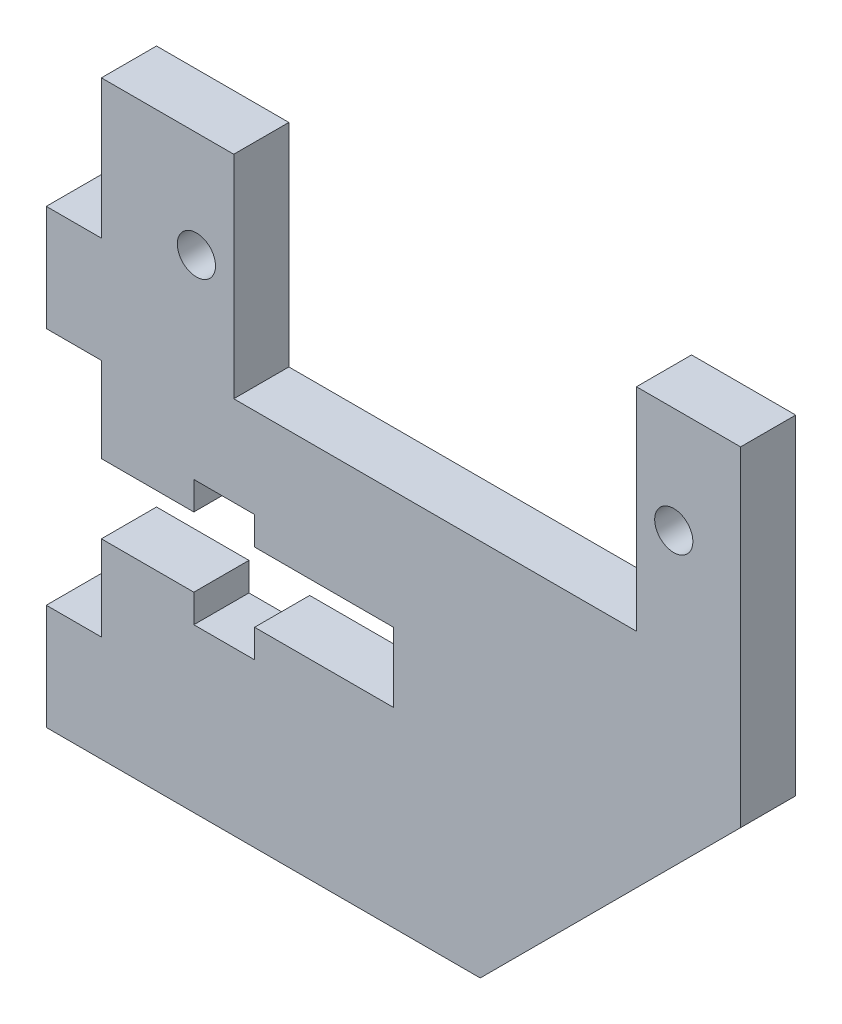
ISO-10303-21;
HEADER;
FILE_DESCRIPTION(('STEP AP214'),'2;1');
FILE_NAME('part.step','',(''),(''),'','','');
FILE_SCHEMA(('AUTOMOTIVE_DESIGN { 1 0 10303 214 1 1 1 1 }'));
ENDSEC;
DATA;
#1=APPLICATION_CONTEXT('core data for automotive mechanical design processes');
#2=APPLICATION_PROTOCOL_DEFINITION('international standard','automotive_design',2000,#1);
#3=PRODUCT_CONTEXT('',#1,'mechanical');
#4=PRODUCT('Part','Part','',(#3));
#5=PRODUCT_RELATED_PRODUCT_CATEGORY('part','',(#4));
#6=PRODUCT_DEFINITION_FORMATION('','',#4);
#7=PRODUCT_DEFINITION_CONTEXT('part definition',#1,'design');
#8=PRODUCT_DEFINITION('design','',#6,#7);
#9=PRODUCT_DEFINITION_SHAPE('','',#8);
#10=(LENGTH_UNIT() NAMED_UNIT(*) SI_UNIT(.MILLI.,.METRE.));
#11=(NAMED_UNIT(*) PLANE_ANGLE_UNIT() SI_UNIT($,.RADIAN.));
#12=(NAMED_UNIT(*) SI_UNIT($,.STERADIAN.) SOLID_ANGLE_UNIT());
#13=UNCERTAINTY_MEASURE_WITH_UNIT(LENGTH_MEASURE(1.E-05),#10,'distance_accuracy_value','');
#14=(GEOMETRIC_REPRESENTATION_CONTEXT(3) GLOBAL_UNCERTAINTY_ASSIGNED_CONTEXT((#13)) GLOBAL_UNIT_ASSIGNED_CONTEXT((#10,
#11,#12)) REPRESENTATION_CONTEXT('',''));
#15=CARTESIAN_POINT('',(0.,0.,0.));
#16=DIRECTION('',(0.,0.,1.));
#17=DIRECTION('',(1.,0.,0.));
#18=AXIS2_PLACEMENT_3D('',#15,#16,#17);
#19=CARTESIAN_POINT('',(3.175,0.,3.175));
#20=DIRECTION('',(1.,0.,0.));
#21=DIRECTION('',(0.,1.,0.));
#22=AXIS2_PLACEMENT_3D('',#19,#20,#21);
#23=PLANE('',#22);
#24=DIRECTION('',(0.,-1.,0.));
#25=VECTOR('',#24,1.);
#26=CARTESIAN_POINT('',(3.175,0.,0.));
#27=LINE('',#26,#25);
#28=CARTESIAN_POINT('',(3.175,19.9,0.));
#29=VERTEX_POINT('',#28);
#30=CARTESIAN_POINT('',(3.175,15.,0.));
#31=VERTEX_POINT('',#30);
#32=EDGE_CURVE('E239',#29,#31,#27,.T.);
#33=ORIENTED_EDGE('',*,*,#32,.T.);
#34=DIRECTION('',(0.,0.,-1.));
#35=VECTOR('',#34,1.);
#36=CARTESIAN_POINT('',(3.175,15.,3.175));
#37=LINE('',#36,#35);
#38=CARTESIAN_POINT('',(3.175,15.,3.175));
#39=VERTEX_POINT('',#38);
#40=EDGE_CURVE('E219',#39,#31,#37,.T.);
#41=ORIENTED_EDGE('',*,*,#40,.F.);
#42=DIRECTION('',(0.,-1.,0.));
#43=VECTOR('',#42,1.);
#44=CARTESIAN_POINT('',(3.175,0.,3.175));
#45=LINE('',#44,#43);
#46=CARTESIAN_POINT('',(3.175,19.9,3.175));
#47=VERTEX_POINT('',#46);
#48=EDGE_CURVE('E226',#47,#39,#45,.T.);
#49=ORIENTED_EDGE('',*,*,#48,.F.);
#50=DIRECTION('',(0.,0.,-1.));
#51=VECTOR('',#50,1.);
#52=CARTESIAN_POINT('',(3.175,19.9,3.175));
#53=LINE('',#52,#51);
#54=EDGE_CURVE('E295',#47,#29,#53,.T.);
#55=ORIENTED_EDGE('',*,*,#54,.T.);
#56=EDGE_LOOP('',(#33,#41,#49,#55));
#57=FACE_BOUND('',#56,.T.);
#58=ADVANCED_FACE('F35',(#57),#23,.F.);
#59=CARTESIAN_POINT('',(0.,15.,3.175));
#60=DIRECTION('',(0.,1.,0.));
#61=DIRECTION('',(0.,0.,1.));
#62=AXIS2_PLACEMENT_3D('',#59,#60,#61);
#63=PLANE('',#62);
#64=DIRECTION('',(1.,0.,0.));
#65=VECTOR('',#64,1.);
#66=CARTESIAN_POINT('',(0.,15.,0.));
#67=LINE('',#66,#65);
#68=CARTESIAN_POINT('',(8.5,15.,0.));
#69=VERTEX_POINT('',#68);
#70=EDGE_CURVE('E364',#31,#69,#67,.T.);
#71=ORIENTED_EDGE('',*,*,#70,.T.);
#72=DIRECTION('',(0.,0.,-1.));
#73=VECTOR('',#72,1.);
#74=CARTESIAN_POINT('',(8.5,15.,3.175));
#75=LINE('',#74,#73);
#76=CARTESIAN_POINT('',(8.5,15.,3.175));
#77=VERTEX_POINT('',#76);
#78=EDGE_CURVE('E221',#77,#69,#75,.T.);
#79=ORIENTED_EDGE('',*,*,#78,.F.);
#80=DIRECTION('',(1.,0.,0.));
#81=VECTOR('',#80,1.);
#82=CARTESIAN_POINT('',(0.,15.,3.175));
#83=LINE('',#82,#81);
#84=EDGE_CURVE('E214',#39,#77,#83,.T.);
#85=ORIENTED_EDGE('',*,*,#84,.F.);
#86=ORIENTED_EDGE('',*,*,#40,.T.);
#87=EDGE_LOOP('',(#71,#79,#85,#86));
#88=FACE_BOUND('',#87,.T.);
#89=ADVANCED_FACE('F217',(#88),#63,.F.);
#90=CARTESIAN_POINT('',(8.5,0.,3.175));
#91=DIRECTION('',(1.,0.,0.));
#92=DIRECTION('',(0.,0.,-1.));
#93=AXIS2_PLACEMENT_3D('',#90,#91,#92);
#94=PLANE('',#93);
#95=DIRECTION('',(0.,-1.,0.));
#96=VECTOR('',#95,1.);
#97=CARTESIAN_POINT('',(8.5,0.,0.));
#98=LINE('',#97,#96);
#99=CARTESIAN_POINT('',(8.5,16.625,0.));
#100=VERTEX_POINT('',#99);
#101=EDGE_CURVE('E361',#100,#69,#98,.T.);
#102=ORIENTED_EDGE('',*,*,#101,.F.);
#103=DIRECTION('',(0.,0.,-1.));
#104=VECTOR('',#103,1.);
#105=CARTESIAN_POINT('',(8.5,16.625,3.175));
#106=LINE('',#105,#104);
#107=CARTESIAN_POINT('',(8.5,16.625,3.175));
#108=VERTEX_POINT('',#107);
#109=EDGE_CURVE('E244',#108,#100,#106,.T.);
#110=ORIENTED_EDGE('',*,*,#109,.F.);
#111=DIRECTION('',(0.,-1.,0.));
#112=VECTOR('',#111,1.);
#113=CARTESIAN_POINT('',(8.5,0.,3.175));
#114=LINE('',#113,#112);
#115=EDGE_CURVE('E225',#108,#77,#114,.T.);
#116=ORIENTED_EDGE('',*,*,#115,.T.);
#117=ORIENTED_EDGE('',*,*,#78,.T.);
#118=EDGE_LOOP('',(#102,#110,#116,#117));
#119=FACE_BOUND('',#118,.T.);
#120=ADVANCED_FACE('F499',(#119),#94,.T.);
#121=CARTESIAN_POINT('',(0.,16.625,3.175));
#122=DIRECTION('',(0.,1.,0.));
#123=DIRECTION('',(0.,0.,1.));
#124=AXIS2_PLACEMENT_3D('',#121,#122,#123);
#125=PLANE('',#124);
#126=DIRECTION('',(1.,0.,0.));
#127=VECTOR('',#126,1.);
#128=CARTESIAN_POINT('',(0.,16.625,0.));
#129=LINE('',#128,#127);
#130=CARTESIAN_POINT('',(12.,16.625,0.));
#131=VERTEX_POINT('',#130);
#132=EDGE_CURVE('E359',#100,#131,#129,.T.);
#133=ORIENTED_EDGE('',*,*,#132,.T.);
#134=DIRECTION('',(0.,0.,-1.));
#135=VECTOR('',#134,1.);
#136=CARTESIAN_POINT('',(12.,16.625,3.175));
#137=LINE('',#136,#135);
#138=CARTESIAN_POINT('',(12.,16.625,3.175));
#139=VERTEX_POINT('',#138);
#140=EDGE_CURVE('E249',#139,#131,#137,.T.);
#141=ORIENTED_EDGE('',*,*,#140,.F.);
#142=DIRECTION('',(1.,0.,0.));
#143=VECTOR('',#142,1.);
#144=CARTESIAN_POINT('',(0.,16.625,3.175));
#145=LINE('',#144,#143);
#146=EDGE_CURVE('E430',#108,#139,#145,.T.);
#147=ORIENTED_EDGE('',*,*,#146,.F.);
#148=ORIENTED_EDGE('',*,*,#109,.T.);
#149=EDGE_LOOP('',(#133,#141,#147,#148));
#150=FACE_BOUND('',#149,.T.);
#151=ADVANCED_FACE('F505',(#150),#125,.F.);
#152=CARTESIAN_POINT('',(12.,0.,3.175));
#153=DIRECTION('',(1.,0.,0.));
#154=DIRECTION('',(0.,0.,-1.));
#155=AXIS2_PLACEMENT_3D('',#152,#153,#154);
#156=PLANE('',#155);
#157=DIRECTION('',(0.,-1.,0.));
#158=VECTOR('',#157,1.);
#159=CARTESIAN_POINT('',(12.,0.,0.));
#160=LINE('',#159,#158);
#161=CARTESIAN_POINT('',(12.,15.,0.));
#162=VERTEX_POINT('',#161);
#163=EDGE_CURVE('E357',#131,#162,#160,.T.);
#164=ORIENTED_EDGE('',*,*,#163,.T.);
#165=DIRECTION('',(0.,0.,-1.));
#166=VECTOR('',#165,1.);
#167=CARTESIAN_POINT('',(12.,15.,3.175));
#168=LINE('',#167,#166);
#169=CARTESIAN_POINT('',(12.,15.,3.175));
#170=VERTEX_POINT('',#169);
#171=EDGE_CURVE('E252',#170,#162,#168,.T.);
#172=ORIENTED_EDGE('',*,*,#171,.F.);
#173=DIRECTION('',(0.,-1.,0.));
#174=VECTOR('',#173,1.);
#175=CARTESIAN_POINT('',(12.,0.,3.175));
#176=LINE('',#175,#174);
#177=EDGE_CURVE('E428',#139,#170,#176,.T.);
#178=ORIENTED_EDGE('',*,*,#177,.F.);
#179=ORIENTED_EDGE('',*,*,#140,.T.);
#180=EDGE_LOOP('',(#164,#172,#178,#179));
#181=FACE_BOUND('',#180,.T.);
#182=ADVANCED_FACE('F507',(#181),#156,.F.);
#183=CARTESIAN_POINT('',(0.,15.,3.175));
#184=DIRECTION('',(0.,1.,0.));
#185=DIRECTION('',(0.,0.,1.));
#186=AXIS2_PLACEMENT_3D('',#183,#184,#185);
#187=PLANE('',#186);
#188=DIRECTION('',(1.,0.,0.));
#189=VECTOR('',#188,1.);
#190=CARTESIAN_POINT('',(0.,15.,0.));
#191=LINE('',#190,#189);
#192=CARTESIAN_POINT('',(20.,15.,0.));
#193=VERTEX_POINT('',#192);
#194=EDGE_CURVE('E355',#162,#193,#191,.T.);
#195=ORIENTED_EDGE('',*,*,#194,.T.);
#196=DIRECTION('',(0.,0.,-1.));
#197=VECTOR('',#196,1.);
#198=CARTESIAN_POINT('',(20.,15.,3.175));
#199=LINE('',#198,#197);
#200=CARTESIAN_POINT('',(20.,15.,3.175));
#201=VERTEX_POINT('',#200);
#202=EDGE_CURVE('E255',#201,#193,#199,.T.);
#203=ORIENTED_EDGE('',*,*,#202,.F.);
#204=DIRECTION('',(1.,0.,0.));
#205=VECTOR('',#204,1.);
#206=CARTESIAN_POINT('',(0.,15.,3.175));
#207=LINE('',#206,#205);
#208=EDGE_CURVE('E426',#170,#201,#207,.T.);
#209=ORIENTED_EDGE('',*,*,#208,.F.);
#210=ORIENTED_EDGE('',*,*,#171,.T.);
#211=EDGE_LOOP('',(#195,#203,#209,#210));
#212=FACE_BOUND('',#211,.T.);
#213=ADVANCED_FACE('F512',(#212),#187,.F.);
#214=CARTESIAN_POINT('',(20.,0.,3.175));
#215=DIRECTION('',(1.,0.,0.));
#216=DIRECTION('',(0.,0.,-1.));
#217=AXIS2_PLACEMENT_3D('',#214,#215,#216);
#218=PLANE('',#217);
#219=DIRECTION('',(0.,-1.,0.));
#220=VECTOR('',#219,1.);
#221=CARTESIAN_POINT('',(20.,0.,0.));
#222=LINE('',#221,#220);
#223=CARTESIAN_POINT('',(20.,11.,0.));
#224=VERTEX_POINT('',#223);
#225=EDGE_CURVE('E352',#193,#224,#222,.T.);
#226=ORIENTED_EDGE('',*,*,#225,.T.);
#227=DIRECTION('',(0.,0.,-1.));
#228=VECTOR('',#227,1.);
#229=CARTESIAN_POINT('',(20.,11.,3.175));
#230=LINE('',#229,#228);
#231=CARTESIAN_POINT('',(20.,11.,3.175));
#232=VERTEX_POINT('',#231);
#233=EDGE_CURVE('E258',#232,#224,#230,.T.);
#234=ORIENTED_EDGE('',*,*,#233,.F.);
#235=DIRECTION('',(0.,-1.,0.));
#236=VECTOR('',#235,1.);
#237=CARTESIAN_POINT('',(20.,0.,3.175));
#238=LINE('',#237,#236);
#239=EDGE_CURVE('E424',#201,#232,#238,.T.);
#240=ORIENTED_EDGE('',*,*,#239,.F.);
#241=ORIENTED_EDGE('',*,*,#202,.T.);
#242=EDGE_LOOP('',(#226,#234,#240,#241));
#243=FACE_BOUND('',#242,.T.);
#244=ADVANCED_FACE('F517',(#243),#218,.F.);
#245=CARTESIAN_POINT('',(0.,11.,3.175));
#246=DIRECTION('',(0.,1.,0.));
#247=DIRECTION('',(0.,0.,1.));
#248=AXIS2_PLACEMENT_3D('',#245,#246,#247);
#249=PLANE('',#248);
#250=DIRECTION('',(1.,0.,0.));
#251=VECTOR('',#250,1.);
#252=CARTESIAN_POINT('',(0.,11.,0.));
#253=LINE('',#252,#251);
#254=CARTESIAN_POINT('',(12.,11.,0.));
#255=VERTEX_POINT('',#254);
#256=EDGE_CURVE('E349',#255,#224,#253,.T.);
#257=ORIENTED_EDGE('',*,*,#256,.F.);
#258=DIRECTION('',(0.,0.,-1.));
#259=VECTOR('',#258,1.);
#260=CARTESIAN_POINT('',(12.,11.,3.175));
#261=LINE('',#260,#259);
#262=CARTESIAN_POINT('',(12.,11.,3.175));
#263=VERTEX_POINT('',#262);
#264=EDGE_CURVE('E260',#263,#255,#261,.T.);
#265=ORIENTED_EDGE('',*,*,#264,.F.);
#266=DIRECTION('',(1.,0.,0.));
#267=VECTOR('',#266,1.);
#268=CARTESIAN_POINT('',(0.,11.,3.175));
#269=LINE('',#268,#267);
#270=EDGE_CURVE('E421',#263,#232,#269,.T.);
#271=ORIENTED_EDGE('',*,*,#270,.T.);
#272=ORIENTED_EDGE('',*,*,#233,.T.);
#273=EDGE_LOOP('',(#257,#265,#271,#272));
#274=FACE_BOUND('',#273,.T.);
#275=ADVANCED_FACE('F521',(#274),#249,.T.);
#276=CARTESIAN_POINT('',(12.,0.,3.175));
#277=DIRECTION('',(1.,0.,0.));
#278=DIRECTION('',(0.,0.,-1.));
#279=AXIS2_PLACEMENT_3D('',#276,#277,#278);
#280=PLANE('',#279);
#281=DIRECTION('',(0.,-1.,0.));
#282=VECTOR('',#281,1.);
#283=CARTESIAN_POINT('',(12.,0.,0.));
#284=LINE('',#283,#282);
#285=CARTESIAN_POINT('',(12.,9.375,0.));
#286=VERTEX_POINT('',#285);
#287=EDGE_CURVE('E346',#255,#286,#284,.T.);
#288=ORIENTED_EDGE('',*,*,#287,.T.);
#289=DIRECTION('',(0.,0.,-1.));
#290=VECTOR('',#289,1.);
#291=CARTESIAN_POINT('',(12.,9.375,3.175));
#292=LINE('',#291,#290);
#293=CARTESIAN_POINT('',(12.,9.375,3.175));
#294=VERTEX_POINT('',#293);
#295=EDGE_CURVE('E262',#294,#286,#292,.T.);
#296=ORIENTED_EDGE('',*,*,#295,.F.);
#297=DIRECTION('',(0.,-1.,0.));
#298=VECTOR('',#297,1.);
#299=CARTESIAN_POINT('',(12.,0.,3.175));
#300=LINE('',#299,#298);
#301=EDGE_CURVE('E419',#263,#294,#300,.T.);
#302=ORIENTED_EDGE('',*,*,#301,.F.);
#303=ORIENTED_EDGE('',*,*,#264,.T.);
#304=EDGE_LOOP('',(#288,#296,#302,#303));
#305=FACE_BOUND('',#304,.T.);
#306=ADVANCED_FACE('F526',(#305),#280,.F.);
#307=CARTESIAN_POINT('',(0.,9.375,3.175));
#308=DIRECTION('',(0.,1.,0.));
#309=DIRECTION('',(0.,0.,1.));
#310=AXIS2_PLACEMENT_3D('',#307,#308,#309);
#311=PLANE('',#310);
#312=DIRECTION('',(1.,0.,0.));
#313=VECTOR('',#312,1.);
#314=CARTESIAN_POINT('',(0.,9.375,0.));
#315=LINE('',#314,#313);
#316=CARTESIAN_POINT('',(8.5,9.375,0.));
#317=VERTEX_POINT('',#316);
#318=EDGE_CURVE('E343',#317,#286,#315,.T.);
#319=ORIENTED_EDGE('',*,*,#318,.F.);
#320=DIRECTION('',(0.,0.,-1.));
#321=VECTOR('',#320,1.);
#322=CARTESIAN_POINT('',(8.5,9.375,3.175));
#323=LINE('',#322,#321);
#324=CARTESIAN_POINT('',(8.5,9.375,3.175));
#325=VERTEX_POINT('',#324);
#326=EDGE_CURVE('E264',#325,#317,#323,.T.);
#327=ORIENTED_EDGE('',*,*,#326,.F.);
#328=DIRECTION('',(1.,0.,0.));
#329=VECTOR('',#328,1.);
#330=CARTESIAN_POINT('',(0.,9.375,3.175));
#331=LINE('',#330,#329);
#332=EDGE_CURVE('E416',#325,#294,#331,.T.);
#333=ORIENTED_EDGE('',*,*,#332,.T.);
#334=ORIENTED_EDGE('',*,*,#295,.T.);
#335=EDGE_LOOP('',(#319,#327,#333,#334));
#336=FACE_BOUND('',#335,.T.);
#337=ADVANCED_FACE('F604',(#336),#311,.T.);
#338=CARTESIAN_POINT('',(8.5,0.,3.175));
#339=DIRECTION('',(1.,0.,0.));
#340=DIRECTION('',(0.,0.,-1.));
#341=AXIS2_PLACEMENT_3D('',#338,#339,#340);
#342=PLANE('',#341);
#343=DIRECTION('',(0.,-1.,0.));
#344=VECTOR('',#343,1.);
#345=CARTESIAN_POINT('',(8.5,0.,0.));
#346=LINE('',#345,#344);
#347=CARTESIAN_POINT('',(8.5,11.,0.));
#348=VERTEX_POINT('',#347);
#349=EDGE_CURVE('E340',#348,#317,#346,.T.);
#350=ORIENTED_EDGE('',*,*,#349,.F.);
#351=DIRECTION('',(0.,0.,-1.));
#352=VECTOR('',#351,1.);
#353=CARTESIAN_POINT('',(8.5,11.,3.175));
#354=LINE('',#353,#352);
#355=CARTESIAN_POINT('',(8.5,11.,3.175));
#356=VERTEX_POINT('',#355);
#357=EDGE_CURVE('E266',#356,#348,#354,.T.);
#358=ORIENTED_EDGE('',*,*,#357,.F.);
#359=DIRECTION('',(0.,-1.,0.));
#360=VECTOR('',#359,1.);
#361=CARTESIAN_POINT('',(8.5,0.,3.175));
#362=LINE('',#361,#360);
#363=EDGE_CURVE('E413',#356,#325,#362,.T.);
#364=ORIENTED_EDGE('',*,*,#363,.T.);
#365=ORIENTED_EDGE('',*,*,#326,.T.);
#366=EDGE_LOOP('',(#350,#358,#364,#365));
#367=FACE_BOUND('',#366,.T.);
#368=ADVANCED_FACE('F533',(#367),#342,.T.);
#369=CARTESIAN_POINT('',(0.,11.,3.175));
#370=DIRECTION('',(0.,1.,0.));
#371=DIRECTION('',(0.,0.,1.));
#372=AXIS2_PLACEMENT_3D('',#369,#370,#371);
#373=PLANE('',#372);
#374=DIRECTION('',(1.,0.,0.));
#375=VECTOR('',#374,1.);
#376=CARTESIAN_POINT('',(0.,11.,0.));
#377=LINE('',#376,#375);
#378=CARTESIAN_POINT('',(3.175,11.,0.));
#379=VERTEX_POINT('',#378);
#380=EDGE_CURVE('E337',#379,#348,#377,.T.);
#381=ORIENTED_EDGE('',*,*,#380,.F.);
#382=DIRECTION('',(0.,0.,-1.));
#383=VECTOR('',#382,1.);
#384=CARTESIAN_POINT('',(3.175,11.,3.175));
#385=LINE('',#384,#383);
#386=CARTESIAN_POINT('',(3.175,11.,3.175));
#387=VERTEX_POINT('',#386);
#388=EDGE_CURVE('E268',#387,#379,#385,.T.);
#389=ORIENTED_EDGE('',*,*,#388,.F.);
#390=DIRECTION('',(1.,0.,0.));
#391=VECTOR('',#390,1.);
#392=CARTESIAN_POINT('',(0.,11.,3.175));
#393=LINE('',#392,#391);
#394=EDGE_CURVE('E410',#387,#356,#393,.T.);
#395=ORIENTED_EDGE('',*,*,#394,.T.);
#396=ORIENTED_EDGE('',*,*,#357,.T.);
#397=EDGE_LOOP('',(#381,#389,#395,#396));
#398=FACE_BOUND('',#397,.T.);
#399=ADVANCED_FACE('F537',(#398),#373,.T.);
#400=CARTESIAN_POINT('',(3.175,0.,3.175));
#401=DIRECTION('',(1.,0.,0.));
#402=DIRECTION('',(0.,1.,0.));
#403=AXIS2_PLACEMENT_3D('',#400,#401,#402);
#404=PLANE('',#403);
#405=DIRECTION('',(0.,-1.,0.));
#406=VECTOR('',#405,1.);
#407=CARTESIAN_POINT('',(3.175,0.,0.));
#408=LINE('',#407,#406);
#409=CARTESIAN_POINT('',(3.175,6.1,0.));
#410=VERTEX_POINT('',#409);
#411=EDGE_CURVE('E334',#379,#410,#408,.T.);
#412=ORIENTED_EDGE('',*,*,#411,.T.);
#413=DIRECTION('',(0.,0.,-1.));
#414=VECTOR('',#413,1.);
#415=CARTESIAN_POINT('',(3.175,6.1,3.175));
#416=LINE('',#415,#414);
#417=CARTESIAN_POINT('',(3.175,6.1,3.175));
#418=VERTEX_POINT('',#417);
#419=EDGE_CURVE('E270',#418,#410,#416,.T.);
#420=ORIENTED_EDGE('',*,*,#419,.F.);
#421=DIRECTION('',(0.,-1.,0.));
#422=VECTOR('',#421,1.);
#423=CARTESIAN_POINT('',(3.175,0.,3.175));
#424=LINE('',#423,#422);
#425=EDGE_CURVE('E408',#387,#418,#424,.T.);
#426=ORIENTED_EDGE('',*,*,#425,.F.);
#427=ORIENTED_EDGE('',*,*,#388,.T.);
#428=EDGE_LOOP('',(#412,#420,#426,#427));
#429=FACE_BOUND('',#428,.T.);
#430=ADVANCED_FACE('F543',(#429),#404,.F.);
#431=CARTESIAN_POINT('',(0.,6.1,3.175));
#432=DIRECTION('',(0.,1.,0.));
#433=DIRECTION('',(0.,0.,1.));
#434=AXIS2_PLACEMENT_3D('',#431,#432,#433);
#435=PLANE('',#434);
#436=DIRECTION('',(1.,0.,0.));
#437=VECTOR('',#436,1.);
#438=CARTESIAN_POINT('',(0.,6.1,0.));
#439=LINE('',#438,#437);
#440=CARTESIAN_POINT('',(0.,6.1,0.));
#441=VERTEX_POINT('',#440);
#442=EDGE_CURVE('E331',#441,#410,#439,.T.);
#443=ORIENTED_EDGE('',*,*,#442,.F.);
#444=DIRECTION('',(0.,0.,-1.));
#445=VECTOR('',#444,1.);
#446=CARTESIAN_POINT('',(0.,6.1,3.175));
#447=LINE('',#446,#445);
#448=CARTESIAN_POINT('',(0.,6.1,3.175));
#449=VERTEX_POINT('',#448);
#450=EDGE_CURVE('E272',#449,#441,#447,.T.);
#451=ORIENTED_EDGE('',*,*,#450,.F.);
#452=DIRECTION('',(1.,0.,0.));
#453=VECTOR('',#452,1.);
#454=CARTESIAN_POINT('',(0.,6.1,3.175));
#455=LINE('',#454,#453);
#456=EDGE_CURVE('E405',#449,#418,#455,.T.);
#457=ORIENTED_EDGE('',*,*,#456,.T.);
#458=ORIENTED_EDGE('',*,*,#419,.T.);
#459=EDGE_LOOP('',(#443,#451,#457,#458));
#460=FACE_BOUND('',#459,.T.);
#461=ADVANCED_FACE('F547',(#460),#435,.T.);
#462=CARTESIAN_POINT('',(0.,0.,3.175));
#463=DIRECTION('',(-1.,0.,0.));
#464=DIRECTION('',(0.,-1.,0.));
#465=AXIS2_PLACEMENT_3D('',#462,#463,#464);
#466=PLANE('',#465);
#467=DIRECTION('',(0.,1.,0.));
#468=VECTOR('',#467,1.);
#469=CARTESIAN_POINT('',(0.,0.,0.));
#470=LINE('',#469,#468);
#471=CARTESIAN_POINT('',(0.,0.,0.));
#472=VERTEX_POINT('',#471);
#473=EDGE_CURVE('E328',#472,#441,#470,.T.);
#474=ORIENTED_EDGE('',*,*,#473,.F.);
#475=DIRECTION('',(0.,0.,-1.));
#476=VECTOR('',#475,1.);
#477=CARTESIAN_POINT('',(0.,0.,3.175));
#478=LINE('',#477,#476);
#479=CARTESIAN_POINT('',(0.,0.,3.175));
#480=VERTEX_POINT('',#479);
#481=EDGE_CURVE('E274',#480,#472,#478,.T.);
#482=ORIENTED_EDGE('',*,*,#481,.F.);
#483=DIRECTION('',(0.,1.,0.));
#484=VECTOR('',#483,1.);
#485=CARTESIAN_POINT('',(0.,0.,3.175));
#486=LINE('',#485,#484);
#487=EDGE_CURVE('E402',#480,#449,#486,.T.);
#488=ORIENTED_EDGE('',*,*,#487,.T.);
#489=ORIENTED_EDGE('',*,*,#450,.T.);
#490=EDGE_LOOP('',(#474,#482,#488,#489));
#491=FACE_BOUND('',#490,.T.);
#492=ADVANCED_FACE('F550',(#491),#466,.T.);
#493=CARTESIAN_POINT('',(0.,0.,3.175));
#494=DIRECTION('',(0.,1.,0.));
#495=DIRECTION('',(-1.,0.,0.));
#496=AXIS2_PLACEMENT_3D('',#493,#494,#495);
#497=PLANE('',#496);
#498=DIRECTION('',(1.,0.,0.));
#499=VECTOR('',#498,1.);
#500=CARTESIAN_POINT('',(0.,0.,0.));
#501=LINE('',#500,#499);
#502=CARTESIAN_POINT('',(25.,0.,0.));
#503=VERTEX_POINT('',#502);
#504=EDGE_CURVE('E326',#472,#503,#501,.T.);
#505=ORIENTED_EDGE('',*,*,#504,.T.);
#506=DIRECTION('',(0.,0.,1.));
#507=VECTOR('',#506,1.);
#508=CARTESIAN_POINT('',(25.,0.,3.175));
#509=LINE('',#508,#507);
#510=CARTESIAN_POINT('',(25.,0.,3.175));
#511=VERTEX_POINT('',#510);
#512=EDGE_CURVE('E43',#503,#511,#509,.T.);
#513=ORIENTED_EDGE('',*,*,#512,.T.);
#514=DIRECTION('',(1.,0.,0.));
#515=VECTOR('',#514,1.);
#516=CARTESIAN_POINT('',(0.,0.,3.175));
#517=LINE('',#516,#515);
#518=EDGE_CURVE('E400',#480,#511,#517,.T.);
#519=ORIENTED_EDGE('',*,*,#518,.F.);
#520=ORIENTED_EDGE('',*,*,#481,.T.);
#521=EDGE_LOOP('',(#505,#513,#519,#520));
#522=FACE_BOUND('',#521,.T.);
#523=ADVANCED_FACE('F591',(#522),#497,.F.);
#524=CARTESIAN_POINT('',(40.,0.,3.175));
#525=DIRECTION('',(-1.,0.,0.));
#526=DIRECTION('',(0.,0.,1.));
#527=AXIS2_PLACEMENT_3D('',#524,#525,#526);
#528=PLANE('',#527);
#529=DIRECTION('',(0.,1.,0.));
#530=VECTOR('',#529,1.);
#531=CARTESIAN_POINT('',(40.,0.,3.175));
#532=LINE('',#531,#530);
#533=CARTESIAN_POINT('',(40.,15.,3.175));
#534=VERTEX_POINT('',#533);
#535=CARTESIAN_POINT('',(40.,34.,3.175));
#536=VERTEX_POINT('',#535);
#537=EDGE_CURVE('E398',#534,#536,#532,.T.);
#538=ORIENTED_EDGE('',*,*,#537,.F.);
#539=DIRECTION('',(0.,0.,-1.));
#540=VECTOR('',#539,1.);
#541=CARTESIAN_POINT('',(40.,15.,3.175));
#542=LINE('',#541,#540);
#543=CARTESIAN_POINT('',(40.,15.,0.));
#544=VERTEX_POINT('',#543);
#545=EDGE_CURVE('E240',#534,#544,#542,.T.);
#546=ORIENTED_EDGE('',*,*,#545,.T.);
#547=DIRECTION('',(0.,1.,0.));
#548=VECTOR('',#547,1.);
#549=CARTESIAN_POINT('',(40.,0.,0.));
#550=LINE('',#549,#548);
#551=CARTESIAN_POINT('',(40.,34.,0.));
#552=VERTEX_POINT('',#551);
#553=EDGE_CURVE('E324',#544,#552,#550,.T.);
#554=ORIENTED_EDGE('',*,*,#553,.T.);
#555=DIRECTION('',(0.,0.,-1.));
#556=VECTOR('',#555,1.);
#557=CARTESIAN_POINT('',(40.,34.,3.175));
#558=LINE('',#557,#556);
#559=EDGE_CURVE('E276',#536,#552,#558,.T.);
#560=ORIENTED_EDGE('',*,*,#559,.F.);
#561=EDGE_LOOP('',(#538,#546,#554,#560));
#562=FACE_BOUND('',#561,.T.);
#563=ADVANCED_FACE('F462',(#562),#528,.F.);
#564=CARTESIAN_POINT('',(0.,34.,3.175));
#565=DIRECTION('',(0.,1.,0.));
#566=DIRECTION('',(-1.,0.,0.));
#567=AXIS2_PLACEMENT_3D('',#564,#565,#566);
#568=PLANE('',#567);
#569=DIRECTION('',(1.,0.,0.));
#570=VECTOR('',#569,1.);
#571=CARTESIAN_POINT('',(0.,34.,0.));
#572=LINE('',#571,#570);
#573=CARTESIAN_POINT('',(34.,34.,0.));
#574=VERTEX_POINT('',#573);
#575=EDGE_CURVE('E321',#574,#552,#572,.T.);
#576=ORIENTED_EDGE('',*,*,#575,.F.);
#577=DIRECTION('',(0.,0.,-1.));
#578=VECTOR('',#577,1.);
#579=CARTESIAN_POINT('',(34.,34.,3.175));
#580=LINE('',#579,#578);
#581=CARTESIAN_POINT('',(34.,34.,3.175));
#582=VERTEX_POINT('',#581);
#583=EDGE_CURVE('E279',#582,#574,#580,.T.);
#584=ORIENTED_EDGE('',*,*,#583,.F.);
#585=DIRECTION('',(1.,0.,0.));
#586=VECTOR('',#585,1.);
#587=CARTESIAN_POINT('',(0.,34.,3.175));
#588=LINE('',#587,#586);
#589=EDGE_CURVE('E395',#582,#536,#588,.T.);
#590=ORIENTED_EDGE('',*,*,#589,.T.);
#591=ORIENTED_EDGE('',*,*,#559,.T.);
#592=EDGE_LOOP('',(#576,#584,#590,#591));
#593=FACE_BOUND('',#592,.T.);
#594=ADVANCED_FACE('F465',(#593),#568,.T.);
#595=CARTESIAN_POINT('',(34.,0.,3.175));
#596=DIRECTION('',(-1.,0.,0.));
#597=DIRECTION('',(0.,0.,1.));
#598=AXIS2_PLACEMENT_3D('',#595,#596,#597);
#599=PLANE('',#598);
#600=DIRECTION('',(0.,1.,0.));
#601=VECTOR('',#600,1.);
#602=CARTESIAN_POINT('',(34.,0.,0.));
#603=LINE('',#602,#601);
#604=CARTESIAN_POINT('',(34.,21.8,0.));
#605=VERTEX_POINT('',#604);
#606=EDGE_CURVE('E318',#605,#574,#603,.T.);
#607=ORIENTED_EDGE('',*,*,#606,.F.);
#608=DIRECTION('',(0.,0.,-1.));
#609=VECTOR('',#608,1.);
#610=CARTESIAN_POINT('',(34.,21.8,3.175));
#611=LINE('',#610,#609);
#612=CARTESIAN_POINT('',(34.,21.8,3.175));
#613=VERTEX_POINT('',#612);
#614=EDGE_CURVE('E281',#613,#605,#611,.T.);
#615=ORIENTED_EDGE('',*,*,#614,.F.);
#616=DIRECTION('',(0.,1.,0.));
#617=VECTOR('',#616,1.);
#618=CARTESIAN_POINT('',(34.,0.,3.175));
#619=LINE('',#618,#617);
#620=EDGE_CURVE('E392',#613,#582,#619,.T.);
#621=ORIENTED_EDGE('',*,*,#620,.T.);
#622=ORIENTED_EDGE('',*,*,#583,.T.);
#623=EDGE_LOOP('',(#607,#615,#621,#622));
#624=FACE_BOUND('',#623,.T.);
#625=ADVANCED_FACE('F471',(#624),#599,.T.);
#626=CARTESIAN_POINT('',(0.,21.8,3.175));
#627=DIRECTION('',(0.,1.,0.));
#628=DIRECTION('',(0.,0.,1.));
#629=AXIS2_PLACEMENT_3D('',#626,#627,#628);
#630=PLANE('',#629);
#631=DIRECTION('',(1.,0.,0.));
#632=VECTOR('',#631,1.);
#633=CARTESIAN_POINT('',(0.,21.8,0.));
#634=LINE('',#633,#632);
#635=CARTESIAN_POINT('',(10.8,21.8,0.));
#636=VERTEX_POINT('',#635);
#637=EDGE_CURVE('E315',#636,#605,#634,.T.);
#638=ORIENTED_EDGE('',*,*,#637,.F.);
#639=DIRECTION('',(0.,0.,-1.));
#640=VECTOR('',#639,1.);
#641=CARTESIAN_POINT('',(10.8,21.8,3.175));
#642=LINE('',#641,#640);
#643=CARTESIAN_POINT('',(10.8,21.8,3.175));
#644=VERTEX_POINT('',#643);
#645=EDGE_CURVE('E283',#644,#636,#642,.T.);
#646=ORIENTED_EDGE('',*,*,#645,.F.);
#647=DIRECTION('',(1.,0.,0.));
#648=VECTOR('',#647,1.);
#649=CARTESIAN_POINT('',(0.,21.8,3.175));
#650=LINE('',#649,#648);
#651=EDGE_CURVE('E389',#644,#613,#650,.T.);
#652=ORIENTED_EDGE('',*,*,#651,.T.);
#653=ORIENTED_EDGE('',*,*,#614,.T.);
#654=EDGE_LOOP('',(#638,#646,#652,#653));
#655=FACE_BOUND('',#654,.T.);
#656=ADVANCED_FACE('F474',(#655),#630,.T.);
#657=CARTESIAN_POINT('',(10.8,0.,3.175));
#658=DIRECTION('',(1.,0.,0.));
#659=DIRECTION('',(0.,0.,-1.));
#660=AXIS2_PLACEMENT_3D('',#657,#658,#659);
#661=PLANE('',#660);
#662=DIRECTION('',(0.,-1.,0.));
#663=VECTOR('',#662,1.);
#664=CARTESIAN_POINT('',(10.8,0.,0.));
#665=LINE('',#664,#663);
#666=CARTESIAN_POINT('',(10.8,34.,0.));
#667=VERTEX_POINT('',#666);
#668=EDGE_CURVE('E312',#667,#636,#665,.T.);
#669=ORIENTED_EDGE('',*,*,#668,.F.);
#670=DIRECTION('',(0.,0.,-1.));
#671=VECTOR('',#670,1.);
#672=CARTESIAN_POINT('',(10.8,34.,3.175));
#673=LINE('',#672,#671);
#674=CARTESIAN_POINT('',(10.8,34.,3.175));
#675=VERTEX_POINT('',#674);
#676=EDGE_CURVE('E285',#675,#667,#673,.T.);
#677=ORIENTED_EDGE('',*,*,#676,.F.);
#678=DIRECTION('',(0.,-1.,0.));
#679=VECTOR('',#678,1.);
#680=CARTESIAN_POINT('',(10.8,0.,3.175));
#681=LINE('',#680,#679);
#682=EDGE_CURVE('E386',#675,#644,#681,.T.);
#683=ORIENTED_EDGE('',*,*,#682,.T.);
#684=ORIENTED_EDGE('',*,*,#645,.T.);
#685=EDGE_LOOP('',(#669,#677,#683,#684));
#686=FACE_BOUND('',#685,.T.);
#687=ADVANCED_FACE('F479',(#686),#661,.T.);
#688=CARTESIAN_POINT('',(0.,34.,3.175));
#689=DIRECTION('',(0.,1.,0.));
#690=DIRECTION('',(0.,0.,1.));
#691=AXIS2_PLACEMENT_3D('',#688,#689,#690);
#692=PLANE('',#691);
#693=DIRECTION('',(1.,0.,0.));
#694=VECTOR('',#693,1.);
#695=CARTESIAN_POINT('',(0.,34.,0.));
#696=LINE('',#695,#694);
#697=CARTESIAN_POINT('',(3.175,34.,0.));
#698=VERTEX_POINT('',#697);
#699=EDGE_CURVE('E309',#698,#667,#696,.T.);
#700=ORIENTED_EDGE('',*,*,#699,.F.);
#701=DIRECTION('',(0.,0.,-1.));
#702=VECTOR('',#701,1.);
#703=CARTESIAN_POINT('',(3.175,34.,3.175));
#704=LINE('',#703,#702);
#705=CARTESIAN_POINT('',(3.175,34.,3.175));
#706=VERTEX_POINT('',#705);
#707=EDGE_CURVE('E287',#706,#698,#704,.T.);
#708=ORIENTED_EDGE('',*,*,#707,.F.);
#709=DIRECTION('',(1.,0.,0.));
#710=VECTOR('',#709,1.);
#711=CARTESIAN_POINT('',(0.,34.,3.175));
#712=LINE('',#711,#710);
#713=EDGE_CURVE('E383',#706,#675,#712,.T.);
#714=ORIENTED_EDGE('',*,*,#713,.T.);
#715=ORIENTED_EDGE('',*,*,#676,.T.);
#716=EDGE_LOOP('',(#700,#708,#714,#715));
#717=FACE_BOUND('',#716,.T.);
#718=ADVANCED_FACE('F482',(#717),#692,.T.);
#719=CARTESIAN_POINT('',(3.175,0.,3.175));
#720=DIRECTION('',(-1.,0.,0.));
#721=DIRECTION('',(0.,0.,1.));
#722=AXIS2_PLACEMENT_3D('',#719,#720,#721);
#723=PLANE('',#722);
#724=DIRECTION('',(0.,1.,0.));
#725=VECTOR('',#724,1.);
#726=CARTESIAN_POINT('',(3.175,0.,0.));
#727=LINE('',#726,#725);
#728=CARTESIAN_POINT('',(3.175,26.,0.));
#729=VERTEX_POINT('',#728);
#730=EDGE_CURVE('E306',#729,#698,#727,.T.);
#731=ORIENTED_EDGE('',*,*,#730,.F.);
#732=DIRECTION('',(0.,0.,-1.));
#733=VECTOR('',#732,1.);
#734=CARTESIAN_POINT('',(3.175,26.,3.175));
#735=LINE('',#734,#733);
#736=CARTESIAN_POINT('',(3.175,26.,3.175));
#737=VERTEX_POINT('',#736);
#738=EDGE_CURVE('E289',#737,#729,#735,.T.);
#739=ORIENTED_EDGE('',*,*,#738,.F.);
#740=DIRECTION('',(0.,1.,0.));
#741=VECTOR('',#740,1.);
#742=CARTESIAN_POINT('',(3.175,0.,3.175));
#743=LINE('',#742,#741);
#744=EDGE_CURVE('E380',#737,#706,#743,.T.);
#745=ORIENTED_EDGE('',*,*,#744,.T.);
#746=ORIENTED_EDGE('',*,*,#707,.T.);
#747=EDGE_LOOP('',(#731,#739,#745,#746));
#748=FACE_BOUND('',#747,.T.);
#749=ADVANCED_FACE('F487',(#748),#723,.T.);
#750=CARTESIAN_POINT('',(0.,26.,3.175));
#751=DIRECTION('',(0.,1.,0.));
#752=DIRECTION('',(0.,0.,1.));
#753=AXIS2_PLACEMENT_3D('',#750,#751,#752);
#754=PLANE('',#753);
#755=DIRECTION('',(1.,0.,0.));
#756=VECTOR('',#755,1.);
#757=CARTESIAN_POINT('',(0.,26.,0.));
#758=LINE('',#757,#756);
#759=CARTESIAN_POINT('',(0.,26.,0.));
#760=VERTEX_POINT('',#759);
#761=EDGE_CURVE('E303',#760,#729,#758,.T.);
#762=ORIENTED_EDGE('',*,*,#761,.F.);
#763=DIRECTION('',(0.,0.,-1.));
#764=VECTOR('',#763,1.);
#765=CARTESIAN_POINT('',(0.,26.,3.175));
#766=LINE('',#765,#764);
#767=CARTESIAN_POINT('',(0.,26.,3.175));
#768=VERTEX_POINT('',#767);
#769=EDGE_CURVE('E291',#768,#760,#766,.T.);
#770=ORIENTED_EDGE('',*,*,#769,.F.);
#771=DIRECTION('',(1.,0.,0.));
#772=VECTOR('',#771,1.);
#773=CARTESIAN_POINT('',(0.,26.,3.175));
#774=LINE('',#773,#772);
#775=EDGE_CURVE('E377',#768,#737,#774,.T.);
#776=ORIENTED_EDGE('',*,*,#775,.T.);
#777=ORIENTED_EDGE('',*,*,#738,.T.);
#778=EDGE_LOOP('',(#762,#770,#776,#777));
#779=FACE_BOUND('',#778,.T.);
#780=ADVANCED_FACE('F490',(#779),#754,.T.);
#781=CARTESIAN_POINT('',(0.,0.,3.175));
#782=DIRECTION('',(-1.,0.,0.));
#783=DIRECTION('',(0.,-1.,0.));
#784=AXIS2_PLACEMENT_3D('',#781,#782,#783);
#785=PLANE('',#784);
#786=DIRECTION('',(0.,1.,0.));
#787=VECTOR('',#786,1.);
#788=CARTESIAN_POINT('',(0.,0.,0.));
#789=LINE('',#788,#787);
#790=CARTESIAN_POINT('',(0.,19.9,0.));
#791=VERTEX_POINT('',#790);
#792=EDGE_CURVE('E300',#791,#760,#789,.T.);
#793=ORIENTED_EDGE('',*,*,#792,.F.);
#794=DIRECTION('',(0.,0.,-1.));
#795=VECTOR('',#794,1.);
#796=CARTESIAN_POINT('',(0.,19.9,3.175));
#797=LINE('',#796,#795);
#798=CARTESIAN_POINT('',(0.,19.9,3.175));
#799=VERTEX_POINT('',#798);
#800=EDGE_CURVE('E293',#799,#791,#797,.T.);
#801=ORIENTED_EDGE('',*,*,#800,.F.);
#802=DIRECTION('',(0.,1.,0.));
#803=VECTOR('',#802,1.);
#804=CARTESIAN_POINT('',(0.,0.,3.175));
#805=LINE('',#804,#803);
#806=EDGE_CURVE('E374',#799,#768,#805,.T.);
#807=ORIENTED_EDGE('',*,*,#806,.T.);
#808=ORIENTED_EDGE('',*,*,#769,.T.);
#809=EDGE_LOOP('',(#793,#801,#807,#808));
#810=FACE_BOUND('',#809,.T.);
#811=ADVANCED_FACE('F451',(#810),#785,.T.);
#812=CARTESIAN_POINT('',(36.15,27.9,3.175));
#813=DIRECTION('',(0.,0.,-1.));
#814=DIRECTION('',(-1.,0.,0.));
#815=AXIS2_PLACEMENT_3D('',#812,#813,#814);
#816=CYLINDRICAL_SURFACE('',#815,1.10000000000001);
#817=CARTESIAN_POINT('',(36.15,27.9,3.175));
#818=DIRECTION('',(0.,0.,1.));
#819=DIRECTION('',(1.,0.,0.));
#820=AXIS2_PLACEMENT_3D('',#817,#818,#819);
#821=CIRCLE('',#820,1.10000000000001);
#822=CARTESIAN_POINT('',(37.25,27.9,3.175));
#823=VERTEX_POINT('',#822);
#824=EDGE_CURVE('E236',#823,#823,#821,.T.);
#825=ORIENTED_EDGE('',*,*,#824,.T.);
#826=EDGE_LOOP('',(#825));
#827=FACE_BOUND('',#826,.T.);
#828=CARTESIAN_POINT('',(36.15,27.9,0.));
#829=DIRECTION('',(0.,0.,1.));
#830=DIRECTION('',(1.,0.,0.));
#831=AXIS2_PLACEMENT_3D('',#828,#829,#830);
#832=CIRCLE('',#831,1.10000000000001);
#833=CARTESIAN_POINT('',(37.25,27.9,0.));
#834=VERTEX_POINT('',#833);
#835=EDGE_CURVE('E367',#834,#834,#832,.T.);
#836=ORIENTED_EDGE('',*,*,#835,.F.);
#837=EDGE_LOOP('',(#836));
#838=FACE_BOUND('',#837,.T.);
#839=ADVANCED_FACE('F448',(#827,#838),#816,.F.);
#840=CARTESIAN_POINT('',(8.65,27.9,3.175));
#841=DIRECTION('',(0.,0.,-1.));
#842=DIRECTION('',(-1.,0.,0.));
#843=AXIS2_PLACEMENT_3D('',#840,#841,#842);
#844=CYLINDRICAL_SURFACE('',#843,1.1);
#845=CARTESIAN_POINT('',(8.65,27.9,3.175));
#846=DIRECTION('',(0.,0.,1.));
#847=DIRECTION('',(1.,0.,0.));
#848=AXIS2_PLACEMENT_3D('',#845,#846,#847);
#849=CIRCLE('',#848,1.1);
#850=CARTESIAN_POINT('',(9.75,27.9,3.175));
#851=VERTEX_POINT('',#850);
#852=EDGE_CURVE('E299',#851,#851,#849,.T.);
#853=ORIENTED_EDGE('',*,*,#852,.T.);
#854=EDGE_LOOP('',(#853));
#855=FACE_BOUND('',#854,.T.);
#856=CARTESIAN_POINT('',(8.65,27.9,0.));
#857=DIRECTION('',(0.,0.,1.));
#858=DIRECTION('',(1.,0.,0.));
#859=AXIS2_PLACEMENT_3D('',#856,#857,#858);
#860=CIRCLE('',#859,1.1);
#861=CARTESIAN_POINT('',(9.75,27.9,0.));
#862=VERTEX_POINT('',#861);
#863=EDGE_CURVE('E370',#862,#862,#860,.T.);
#864=ORIENTED_EDGE('',*,*,#863,.F.);
#865=EDGE_LOOP('',(#864));
#866=FACE_BOUND('',#865,.T.);
#867=ADVANCED_FACE('F438',(#855,#866),#844,.F.);
#868=CARTESIAN_POINT('',(0.,19.9,3.175));
#869=DIRECTION('',(0.,1.,0.));
#870=DIRECTION('',(0.,0.,1.));
#871=AXIS2_PLACEMENT_3D('',#868,#869,#870);
#872=PLANE('',#871);
#873=DIRECTION('',(1.,0.,0.));
#874=VECTOR('',#873,1.);
#875=CARTESIAN_POINT('',(0.,19.9,0.));
#876=LINE('',#875,#874);
#877=EDGE_CURVE('E297',#791,#29,#876,.T.);
#878=ORIENTED_EDGE('',*,*,#877,.T.);
#879=ORIENTED_EDGE('',*,*,#54,.F.);
#880=DIRECTION('',(1.,0.,0.));
#881=VECTOR('',#880,1.);
#882=CARTESIAN_POINT('',(0.,19.9,3.175));
#883=LINE('',#882,#881);
#884=EDGE_CURVE('E232',#799,#47,#883,.T.);
#885=ORIENTED_EDGE('',*,*,#884,.F.);
#886=ORIENTED_EDGE('',*,*,#800,.T.);
#887=EDGE_LOOP('',(#878,#879,#885,#886));
#888=FACE_BOUND('',#887,.T.);
#889=ADVANCED_FACE('F444',(#888),#872,.F.);
#890=CARTESIAN_POINT('',(0.,0.,3.175));
#891=DIRECTION('',(0.,0.,1.));
#892=DIRECTION('',(1.,0.,0.));
#893=AXIS2_PLACEMENT_3D('',#890,#891,#892);
#894=PLANE('',#893);
#895=ORIENTED_EDGE('',*,*,#852,.F.);
#896=EDGE_LOOP('',(#895));
#897=FACE_BOUND('',#896,.T.);
#898=ORIENTED_EDGE('',*,*,#824,.F.);
#899=EDGE_LOOP('',(#898));
#900=FACE_BOUND('',#899,.T.);
#901=ORIENTED_EDGE('',*,*,#518,.T.);
#902=DIRECTION('',(-0.707106781186549,-0.707106781186546,0.));
#903=VECTOR('',#902,1.);
#904=CARTESIAN_POINT('',(12.4999999999999,-12.5,3.175));
#905=LINE('',#904,#903);
#906=EDGE_CURVE('E11',#511,#534,#905,.F.);
#907=ORIENTED_EDGE('',*,*,#906,.T.);
#908=ORIENTED_EDGE('',*,*,#537,.T.);
#909=ORIENTED_EDGE('',*,*,#589,.F.);
#910=ORIENTED_EDGE('',*,*,#620,.F.);
#911=ORIENTED_EDGE('',*,*,#651,.F.);
#912=ORIENTED_EDGE('',*,*,#682,.F.);
#913=ORIENTED_EDGE('',*,*,#713,.F.);
#914=ORIENTED_EDGE('',*,*,#744,.F.);
#915=ORIENTED_EDGE('',*,*,#775,.F.);
#916=ORIENTED_EDGE('',*,*,#806,.F.);
#917=ORIENTED_EDGE('',*,*,#884,.T.);
#918=ORIENTED_EDGE('',*,*,#48,.T.);
#919=ORIENTED_EDGE('',*,*,#84,.T.);
#920=ORIENTED_EDGE('',*,*,#115,.F.);
#921=ORIENTED_EDGE('',*,*,#146,.T.);
#922=ORIENTED_EDGE('',*,*,#177,.T.);
#923=ORIENTED_EDGE('',*,*,#208,.T.);
#924=ORIENTED_EDGE('',*,*,#239,.T.);
#925=ORIENTED_EDGE('',*,*,#270,.F.);
#926=ORIENTED_EDGE('',*,*,#301,.T.);
#927=ORIENTED_EDGE('',*,*,#332,.F.);
#928=ORIENTED_EDGE('',*,*,#363,.F.);
#929=ORIENTED_EDGE('',*,*,#394,.F.);
#930=ORIENTED_EDGE('',*,*,#425,.T.);
#931=ORIENTED_EDGE('',*,*,#456,.F.);
#932=ORIENTED_EDGE('',*,*,#487,.F.);
#933=EDGE_LOOP('',(#901,#907,#908,#909,#910,#911,#912,#913,#914,#915,#916,#917,#918,#919,#920,
#921,#922,#923,#924,#925,#926,#927,#928,#929,#930,#931,#932));
#934=FACE_BOUND('',#933,.T.);
#935=ADVANCED_FACE('F229',(#897,#900,#934),#894,.T.);
#936=CARTESIAN_POINT('',(0.,0.,0.));
#937=DIRECTION('',(0.,0.,1.));
#938=DIRECTION('',(1.,0.,0.));
#939=AXIS2_PLACEMENT_3D('',#936,#937,#938);
#940=PLANE('',#939);
#941=ORIENTED_EDGE('',*,*,#863,.T.);
#942=EDGE_LOOP('',(#941));
#943=FACE_BOUND('',#942,.T.);
#944=ORIENTED_EDGE('',*,*,#835,.T.);
#945=EDGE_LOOP('',(#944));
#946=FACE_BOUND('',#945,.T.);
#947=ORIENTED_EDGE('',*,*,#553,.F.);
#948=DIRECTION('',(0.707106781186549,0.707106781186546,0.));
#949=VECTOR('',#948,1.);
#950=CARTESIAN_POINT('',(40.,15.,0.));
#951=LINE('',#950,#949);
#952=EDGE_CURVE('E57',#544,#503,#951,.F.);
#953=ORIENTED_EDGE('',*,*,#952,.T.);
#954=ORIENTED_EDGE('',*,*,#504,.F.);
#955=ORIENTED_EDGE('',*,*,#473,.T.);
#956=ORIENTED_EDGE('',*,*,#442,.T.);
#957=ORIENTED_EDGE('',*,*,#411,.F.);
#958=ORIENTED_EDGE('',*,*,#380,.T.);
#959=ORIENTED_EDGE('',*,*,#349,.T.);
#960=ORIENTED_EDGE('',*,*,#318,.T.);
#961=ORIENTED_EDGE('',*,*,#287,.F.);
#962=ORIENTED_EDGE('',*,*,#256,.T.);
#963=ORIENTED_EDGE('',*,*,#225,.F.);
#964=ORIENTED_EDGE('',*,*,#194,.F.);
#965=ORIENTED_EDGE('',*,*,#163,.F.);
#966=ORIENTED_EDGE('',*,*,#132,.F.);
#967=ORIENTED_EDGE('',*,*,#101,.T.);
#968=ORIENTED_EDGE('',*,*,#70,.F.);
#969=ORIENTED_EDGE('',*,*,#32,.F.);
#970=ORIENTED_EDGE('',*,*,#877,.F.);
#971=ORIENTED_EDGE('',*,*,#792,.T.);
#972=ORIENTED_EDGE('',*,*,#761,.T.);
#973=ORIENTED_EDGE('',*,*,#730,.T.);
#974=ORIENTED_EDGE('',*,*,#699,.T.);
#975=ORIENTED_EDGE('',*,*,#668,.T.);
#976=ORIENTED_EDGE('',*,*,#637,.T.);
#977=ORIENTED_EDGE('',*,*,#606,.T.);
#978=ORIENTED_EDGE('',*,*,#575,.T.);
#979=EDGE_LOOP('',(#947,#953,#954,#955,#956,#957,#958,#959,#960,#961,#962,#963,#964,#965,#966,
#967,#968,#969,#970,#971,#972,#973,#974,#975,#976,#977,#978));
#980=FACE_BOUND('',#979,.T.);
#981=ADVANCED_FACE('F443',(#943,#946,#980),#940,.F.);
#982=CARTESIAN_POINT('',(40.,15.,3.175));
#983=DIRECTION('',(-0.707106781186546,0.707106781186549,0.));
#984=DIRECTION('',(0.,0.,-1.));
#985=AXIS2_PLACEMENT_3D('',#982,#983,#984);
#986=PLANE('',#985);
#987=ORIENTED_EDGE('',*,*,#906,.F.);
#988=ORIENTED_EDGE('',*,*,#512,.F.);
#989=ORIENTED_EDGE('',*,*,#952,.F.);
#990=ORIENTED_EDGE('',*,*,#545,.F.);
#991=EDGE_LOOP('',(#987,#988,#989,#990));
#992=FACE_BOUND('',#991,.T.);
#993=ADVANCED_FACE('F37',(#992),#986,.F.);
#994=CLOSED_SHELL('',(#58,#89,#120,#151,#182,#213,#244,#275,#306,#337,#368,#399,#430,#461,#492,
#523,#563,#594,#625,#656,#687,#718,#749,#780,#811,#839,#867,#889,#935,#981,#993));
#995=MANIFOLD_SOLID_BREP('B2',#994);
#996=ADVANCED_BREP_SHAPE_REPRESENTATION('',(#18,#995),#14);
#997=SHAPE_DEFINITION_REPRESENTATION(#9,#996);
ENDSEC;
END-ISO-10303-21;
